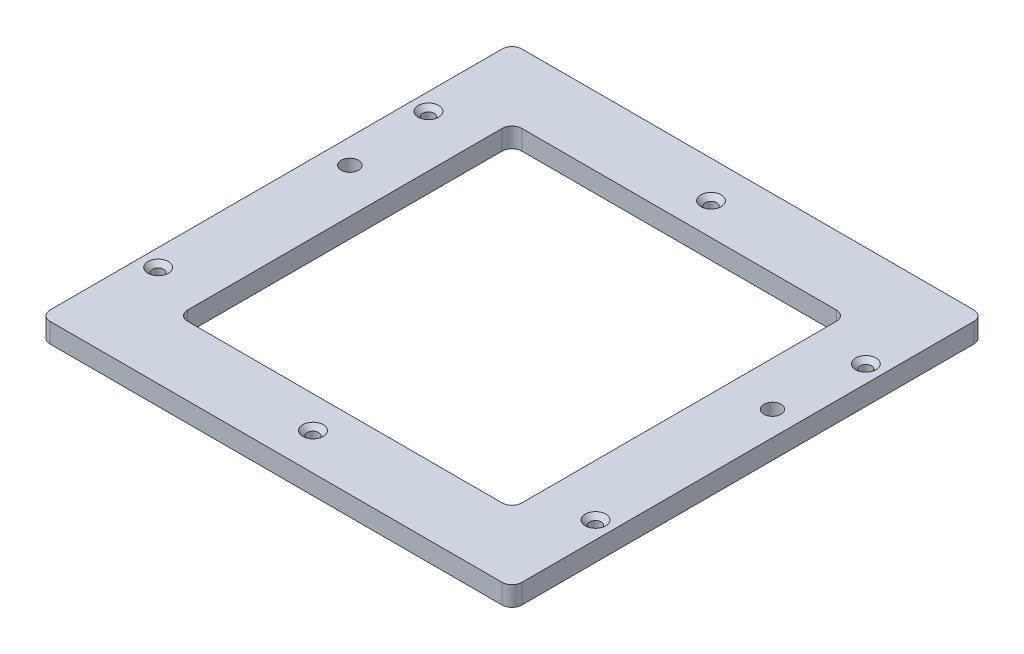
ISO-10303-21;
HEADER;
FILE_DESCRIPTION(('STEP AP214'),'2;1');
FILE_NAME('part.step','',(''),(''),'','','');
FILE_SCHEMA(('AUTOMOTIVE_DESIGN { 1 0 10303 214 1 1 1 1 }'));
ENDSEC;
DATA;
#1=APPLICATION_CONTEXT('core data for automotive mechanical design processes');
#2=APPLICATION_PROTOCOL_DEFINITION('international standard','automotive_design',2000,#1);
#3=PRODUCT_CONTEXT('',#1,'mechanical');
#4=PRODUCT('Part','Part','',(#3));
#5=PRODUCT_RELATED_PRODUCT_CATEGORY('part','',(#4));
#6=PRODUCT_DEFINITION_FORMATION('','',#4);
#7=PRODUCT_DEFINITION_CONTEXT('part definition',#1,'design');
#8=PRODUCT_DEFINITION('design','',#6,#7);
#9=PRODUCT_DEFINITION_SHAPE('','',#8);
#10=(LENGTH_UNIT() NAMED_UNIT(*) SI_UNIT(.MILLI.,.METRE.));
#11=(NAMED_UNIT(*) PLANE_ANGLE_UNIT() SI_UNIT($,.RADIAN.));
#12=(NAMED_UNIT(*) SI_UNIT($,.STERADIAN.) SOLID_ANGLE_UNIT());
#13=UNCERTAINTY_MEASURE_WITH_UNIT(LENGTH_MEASURE(1.E-05),#10,'distance_accuracy_value','');
#14=(GEOMETRIC_REPRESENTATION_CONTEXT(3) GLOBAL_UNCERTAINTY_ASSIGNED_CONTEXT((#13)) GLOBAL_UNIT_ASSIGNED_CONTEXT((#10,
#11,#12)) REPRESENTATION_CONTEXT('',''));
#15=CARTESIAN_POINT('',(0.,0.,0.));
#16=DIRECTION('',(0.,0.,1.));
#17=DIRECTION('',(1.,0.,0.));
#18=AXIS2_PLACEMENT_3D('',#15,#16,#17);
#19=CARTESIAN_POINT('',(120.,10.,-120.));
#20=DIRECTION('',(-1.,0.,0.));
#21=DIRECTION('',(0.,0.,1.));
#22=AXIS2_PLACEMENT_3D('',#19,#20,#21);
#23=PLANE('',#22);
#24=DIRECTION('',(0.,0.,-1.));
#25=VECTOR('',#24,1.);
#26=CARTESIAN_POINT('',(120.,0.,-120.));
#27=LINE('',#26,#25);
#28=CARTESIAN_POINT('',(120.,0.,115.));
#29=VERTEX_POINT('',#28);
#30=CARTESIAN_POINT('',(120.,0.,-115.));
#31=VERTEX_POINT('',#30);
#32=EDGE_CURVE('E343',#29,#31,#27,.T.);
#33=ORIENTED_EDGE('',*,*,#32,.T.);
#34=DIRECTION('',(0.,-1.,0.));
#35=VECTOR('',#34,1.);
#36=CARTESIAN_POINT('',(120.,10.,-115.));
#37=LINE('',#36,#35);
#38=CARTESIAN_POINT('',(120.,10.,-115.));
#39=VERTEX_POINT('',#38);
#40=EDGE_CURVE('E209',#31,#39,#37,.F.);
#41=ORIENTED_EDGE('',*,*,#40,.T.);
#42=DIRECTION('',(0.,0.,-1.));
#43=VECTOR('',#42,1.);
#44=CARTESIAN_POINT('',(120.,10.,-120.));
#45=LINE('',#44,#43);
#46=CARTESIAN_POINT('',(120.,10.,115.));
#47=VERTEX_POINT('',#46);
#48=EDGE_CURVE('E175',#47,#39,#45,.T.);
#49=ORIENTED_EDGE('',*,*,#48,.F.);
#50=DIRECTION('',(0.,-1.,0.));
#51=VECTOR('',#50,1.);
#52=CARTESIAN_POINT('',(120.,10.,115.));
#53=LINE('',#52,#51);
#54=EDGE_CURVE('E206',#47,#29,#53,.T.);
#55=ORIENTED_EDGE('',*,*,#54,.T.);
#56=EDGE_LOOP('',(#33,#41,#49,#55));
#57=FACE_BOUND('',#56,.T.);
#58=ADVANCED_FACE('F35',(#57),#23,.F.);
#59=CARTESIAN_POINT('',(-120.,10.,-120.));
#60=DIRECTION('',(0.,0.,1.));
#61=DIRECTION('',(1.,0.,0.));
#62=AXIS2_PLACEMENT_3D('',#59,#60,#61);
#63=PLANE('',#62);
#64=DIRECTION('',(-1.,0.,0.));
#65=VECTOR('',#64,1.);
#66=CARTESIAN_POINT('',(-120.,0.,-120.));
#67=LINE('',#66,#65);
#68=CARTESIAN_POINT('',(115.,0.,-120.));
#69=VERTEX_POINT('',#68);
#70=CARTESIAN_POINT('',(-115.,0.,-120.));
#71=VERTEX_POINT('',#70);
#72=EDGE_CURVE('E181',#69,#71,#67,.T.);
#73=ORIENTED_EDGE('',*,*,#72,.T.);
#74=DIRECTION('',(0.,-1.,0.));
#75=VECTOR('',#74,1.);
#76=CARTESIAN_POINT('',(-115.,10.,-120.));
#77=LINE('',#76,#75);
#78=CARTESIAN_POINT('',(-115.,10.,-120.));
#79=VERTEX_POINT('',#78);
#80=EDGE_CURVE('E204',#71,#79,#77,.F.);
#81=ORIENTED_EDGE('',*,*,#80,.T.);
#82=DIRECTION('',(-1.,0.,0.));
#83=VECTOR('',#82,1.);
#84=CARTESIAN_POINT('',(-120.,10.,-120.));
#85=LINE('',#84,#83);
#86=CARTESIAN_POINT('',(115.,10.,-120.));
#87=VERTEX_POINT('',#86);
#88=EDGE_CURVE('E179',#87,#79,#85,.T.);
#89=ORIENTED_EDGE('',*,*,#88,.F.);
#90=DIRECTION('',(0.,-1.,0.));
#91=VECTOR('',#90,1.);
#92=CARTESIAN_POINT('',(115.,10.,-120.));
#93=LINE('',#92,#91);
#94=EDGE_CURVE('E201',#87,#69,#93,.T.);
#95=ORIENTED_EDGE('',*,*,#94,.T.);
#96=EDGE_LOOP('',(#73,#81,#89,#95));
#97=FACE_BOUND('',#96,.T.);
#98=ADVANCED_FACE('F356',(#97),#63,.F.);
#99=CARTESIAN_POINT('',(-120.,10.,-120.));
#100=DIRECTION('',(1.,0.,0.));
#101=DIRECTION('',(0.,0.,-1.));
#102=AXIS2_PLACEMENT_3D('',#99,#100,#101);
#103=PLANE('',#102);
#104=DIRECTION('',(0.,0.,1.));
#105=VECTOR('',#104,1.);
#106=CARTESIAN_POINT('',(-120.,0.,-120.));
#107=LINE('',#106,#105);
#108=CARTESIAN_POINT('',(-120.,0.,-115.));
#109=VERTEX_POINT('',#108);
#110=CARTESIAN_POINT('',(-120.,0.,115.));
#111=VERTEX_POINT('',#110);
#112=EDGE_CURVE('E176',#109,#111,#107,.T.);
#113=ORIENTED_EDGE('',*,*,#112,.T.);
#114=DIRECTION('',(0.,-1.,0.));
#115=VECTOR('',#114,1.);
#116=CARTESIAN_POINT('',(-120.,10.,115.));
#117=LINE('',#116,#115);
#118=CARTESIAN_POINT('',(-120.,10.,115.));
#119=VERTEX_POINT('',#118);
#120=EDGE_CURVE('E154',#111,#119,#117,.F.);
#121=ORIENTED_EDGE('',*,*,#120,.T.);
#122=DIRECTION('',(0.,0.,1.));
#123=VECTOR('',#122,1.);
#124=CARTESIAN_POINT('',(-120.,10.,-120.));
#125=LINE('',#124,#123);
#126=CARTESIAN_POINT('',(-120.,10.,-115.));
#127=VERTEX_POINT('',#126);
#128=EDGE_CURVE('E347',#127,#119,#125,.T.);
#129=ORIENTED_EDGE('',*,*,#128,.F.);
#130=DIRECTION('',(0.,-1.,0.));
#131=VECTOR('',#130,1.);
#132=CARTESIAN_POINT('',(-120.,10.,-115.));
#133=LINE('',#132,#131);
#134=EDGE_CURVE('E159',#127,#109,#133,.T.);
#135=ORIENTED_EDGE('',*,*,#134,.T.);
#136=EDGE_LOOP('',(#113,#121,#129,#135));
#137=FACE_BOUND('',#136,.T.);
#138=ADVANCED_FACE('F366',(#137),#103,.F.);
#139=CARTESIAN_POINT('',(-120.,10.,120.));
#140=DIRECTION('',(0.,0.,-1.));
#141=DIRECTION('',(-1.,0.,0.));
#142=AXIS2_PLACEMENT_3D('',#139,#140,#141);
#143=PLANE('',#142);
#144=DIRECTION('',(1.,0.,0.));
#145=VECTOR('',#144,1.);
#146=CARTESIAN_POINT('',(-120.,10.,120.));
#147=LINE('',#146,#145);
#148=CARTESIAN_POINT('',(-115.,10.,120.));
#149=VERTEX_POINT('',#148);
#150=CARTESIAN_POINT('',(115.,10.,120.));
#151=VERTEX_POINT('',#150);
#152=EDGE_CURVE('E169',#149,#151,#147,.T.);
#153=ORIENTED_EDGE('',*,*,#152,.F.);
#154=DIRECTION('',(0.,-1.,0.));
#155=VECTOR('',#154,1.);
#156=CARTESIAN_POINT('',(-115.,10.,120.));
#157=LINE('',#156,#155);
#158=CARTESIAN_POINT('',(-115.,0.,120.));
#159=VERTEX_POINT('',#158);
#160=EDGE_CURVE('E153',#149,#159,#157,.T.);
#161=ORIENTED_EDGE('',*,*,#160,.T.);
#162=DIRECTION('',(1.,0.,0.));
#163=VECTOR('',#162,1.);
#164=CARTESIAN_POINT('',(-120.,0.,120.));
#165=LINE('',#164,#163);
#166=CARTESIAN_POINT('',(115.,0.,120.));
#167=VERTEX_POINT('',#166);
#168=EDGE_CURVE('E166',#159,#167,#165,.T.);
#169=ORIENTED_EDGE('',*,*,#168,.T.);
#170=DIRECTION('',(0.,-1.,0.));
#171=VECTOR('',#170,1.);
#172=CARTESIAN_POINT('',(115.,10.,120.));
#173=LINE('',#172,#171);
#174=EDGE_CURVE('E171',#167,#151,#173,.F.);
#175=ORIENTED_EDGE('',*,*,#174,.T.);
#176=EDGE_LOOP('',(#153,#161,#169,#175));
#177=FACE_BOUND('',#176,.T.);
#178=ADVANCED_FACE('F165',(#177),#143,.F.);
#179=CARTESIAN_POINT('',(0.,10.,0.));
#180=DIRECTION('',(0.,1.,0.));
#181=DIRECTION('',(0.,0.,1.));
#182=AXIS2_PLACEMENT_3D('',#179,#180,#181);
#183=PLANE('',#182);
#184=DIRECTION('',(-1.,0.,0.));
#185=VECTOR('',#184,1.);
#186=CARTESIAN_POINT('',(85.,10.,-85.));
#187=LINE('',#186,#185);
#188=CARTESIAN_POINT('',(80.,10.,-85.));
#189=VERTEX_POINT('',#188);
#190=CARTESIAN_POINT('',(-80.,10.,-85.));
#191=VERTEX_POINT('',#190);
#192=EDGE_CURVE('E250',#189,#191,#187,.T.);
#193=ORIENTED_EDGE('',*,*,#192,.F.);
#194=CARTESIAN_POINT('',(80.,10.,-80.));
#195=DIRECTION('',(0.,1.,0.));
#196=DIRECTION('',(0.,0.,1.));
#197=AXIS2_PLACEMENT_3D('',#194,#195,#196);
#198=CIRCLE('',#197,5.);
#199=CARTESIAN_POINT('',(85.,10.,-80.));
#200=VERTEX_POINT('',#199);
#201=EDGE_CURVE('E243',#189,#200,#198,.F.);
#202=ORIENTED_EDGE('',*,*,#201,.T.);
#203=DIRECTION('',(0.,0.,-1.));
#204=VECTOR('',#203,1.);
#205=CARTESIAN_POINT('',(85.,10.,85.));
#206=LINE('',#205,#204);
#207=CARTESIAN_POINT('',(85.,10.,80.));
#208=VERTEX_POINT('',#207);
#209=EDGE_CURVE('E273',#208,#200,#206,.T.);
#210=ORIENTED_EDGE('',*,*,#209,.F.);
#211=CARTESIAN_POINT('',(80.,10.,80.));
#212=DIRECTION('',(0.,1.,0.));
#213=DIRECTION('',(0.,0.,1.));
#214=AXIS2_PLACEMENT_3D('',#211,#212,#213);
#215=CIRCLE('',#214,5.);
#216=CARTESIAN_POINT('',(80.,10.,85.));
#217=VERTEX_POINT('',#216);
#218=EDGE_CURVE('E235',#208,#217,#215,.F.);
#219=ORIENTED_EDGE('',*,*,#218,.T.);
#220=DIRECTION('',(1.,0.,0.));
#221=VECTOR('',#220,1.);
#222=CARTESIAN_POINT('',(-85.,10.,85.));
#223=LINE('',#222,#221);
#224=CARTESIAN_POINT('',(-80.,10.,85.));
#225=VERTEX_POINT('',#224);
#226=EDGE_CURVE('E278',#225,#217,#223,.T.);
#227=ORIENTED_EDGE('',*,*,#226,.F.);
#228=CARTESIAN_POINT('',(-80.,10.,80.));
#229=DIRECTION('',(0.,1.,0.));
#230=DIRECTION('',(0.,0.,1.));
#231=AXIS2_PLACEMENT_3D('',#228,#229,#230);
#232=CIRCLE('',#231,5.);
#233=CARTESIAN_POINT('',(-85.,10.,80.));
#234=VERTEX_POINT('',#233);
#235=EDGE_CURVE('E239',#225,#234,#232,.F.);
#236=ORIENTED_EDGE('',*,*,#235,.T.);
#237=DIRECTION('',(0.,0.,1.));
#238=VECTOR('',#237,1.);
#239=CARTESIAN_POINT('',(-85.,10.,-85.));
#240=LINE('',#239,#238);
#241=CARTESIAN_POINT('',(-85.,10.,-80.));
#242=VERTEX_POINT('',#241);
#243=EDGE_CURVE('E252',#242,#234,#240,.T.);
#244=ORIENTED_EDGE('',*,*,#243,.F.);
#245=CARTESIAN_POINT('',(-80.,10.,-80.));
#246=DIRECTION('',(0.,1.,0.));
#247=DIRECTION('',(0.,0.,1.));
#248=AXIS2_PLACEMENT_3D('',#245,#246,#247);
#249=CIRCLE('',#248,5.);
#250=EDGE_CURVE('E43',#242,#191,#249,.F.);
#251=ORIENTED_EDGE('',*,*,#250,.T.);
#252=EDGE_LOOP('',(#193,#202,#210,#219,#227,#236,#244,#251));
#253=FACE_BOUND('',#252,.T.);
#254=CARTESIAN_POINT('',(107.5,10.,-25.));
#255=DIRECTION('',(0.,1.,0.));
#256=DIRECTION('',(0.,0.,1.));
#257=AXIS2_PLACEMENT_3D('',#254,#255,#256);
#258=CIRCLE('',#257,4.4);
#259=CARTESIAN_POINT('',(107.5,10.,-20.6));
#260=VERTEX_POINT('',#259);
#261=EDGE_CURVE('E216',#260,#260,#258,.T.);
#262=ORIENTED_EDGE('',*,*,#261,.F.);
#263=EDGE_LOOP('',(#262));
#264=FACE_BOUND('',#263,.T.);
#265=CARTESIAN_POINT('',(-107.5,10.,-25.));
#266=DIRECTION('',(0.,1.,0.));
#267=DIRECTION('',(0.,0.,1.));
#268=AXIS2_PLACEMENT_3D('',#265,#266,#267);
#269=CIRCLE('',#268,4.4);
#270=CARTESIAN_POINT('',(-107.5,10.,-20.6));
#271=VERTEX_POINT('',#270);
#272=EDGE_CURVE('E215',#271,#271,#269,.T.);
#273=ORIENTED_EDGE('',*,*,#272,.F.);
#274=EDGE_LOOP('',(#273));
#275=FACE_BOUND('',#274,.T.);
#276=CARTESIAN_POINT('',(-111.25,10.,-68.75));
#277=DIRECTION('',(0.,1.,0.));
#278=DIRECTION('',(0.,0.,1.));
#279=AXIS2_PLACEMENT_3D('',#276,#277,#278);
#280=CIRCLE('',#279,5.2);
#281=CARTESIAN_POINT('',(-111.25,10.,-63.55));
#282=VERTEX_POINT('',#281);
#283=EDGE_CURVE('E290',#282,#282,#280,.T.);
#284=ORIENTED_EDGE('',*,*,#283,.F.);
#285=EDGE_LOOP('',(#284));
#286=FACE_BOUND('',#285,.T.);
#287=CARTESIAN_POINT('',(0.,10.,-101.25));
#288=DIRECTION('',(0.,1.,0.));
#289=DIRECTION('',(0.,0.,1.));
#290=AXIS2_PLACEMENT_3D('',#287,#288,#289);
#291=CIRCLE('',#290,5.2);
#292=CARTESIAN_POINT('',(0.,10.,-96.05));
#293=VERTEX_POINT('',#292);
#294=EDGE_CURVE('E299',#293,#293,#291,.T.);
#295=ORIENTED_EDGE('',*,*,#294,.F.);
#296=EDGE_LOOP('',(#295));
#297=FACE_BOUND('',#296,.T.);
#298=CARTESIAN_POINT('',(111.25,10.,-68.75));
#299=DIRECTION('',(0.,1.,0.));
#300=DIRECTION('',(0.,0.,1.));
#301=AXIS2_PLACEMENT_3D('',#298,#299,#300);
#302=CIRCLE('',#301,5.2);
#303=CARTESIAN_POINT('',(111.25,10.,-63.55));
#304=VERTEX_POINT('',#303);
#305=EDGE_CURVE('E308',#304,#304,#302,.T.);
#306=ORIENTED_EDGE('',*,*,#305,.F.);
#307=EDGE_LOOP('',(#306));
#308=FACE_BOUND('',#307,.T.);
#309=CARTESIAN_POINT('',(111.25,10.,68.75));
#310=DIRECTION('',(0.,1.,0.));
#311=DIRECTION('',(0.,0.,1.));
#312=AXIS2_PLACEMENT_3D('',#309,#310,#311);
#313=CIRCLE('',#312,5.2);
#314=CARTESIAN_POINT('',(111.25,10.,73.95));
#315=VERTEX_POINT('',#314);
#316=EDGE_CURVE('E317',#315,#315,#313,.T.);
#317=ORIENTED_EDGE('',*,*,#316,.F.);
#318=EDGE_LOOP('',(#317));
#319=FACE_BOUND('',#318,.T.);
#320=CARTESIAN_POINT('',(0.,10.,101.25));
#321=DIRECTION('',(0.,1.,0.));
#322=DIRECTION('',(0.,0.,1.));
#323=AXIS2_PLACEMENT_3D('',#320,#321,#322);
#324=CIRCLE('',#323,5.2);
#325=CARTESIAN_POINT('',(0.,10.,106.45));
#326=VERTEX_POINT('',#325);
#327=EDGE_CURVE('E326',#326,#326,#324,.T.);
#328=ORIENTED_EDGE('',*,*,#327,.F.);
#329=EDGE_LOOP('',(#328));
#330=FACE_BOUND('',#329,.T.);
#331=CARTESIAN_POINT('',(-111.25,10.,68.75));
#332=DIRECTION('',(0.,1.,0.));
#333=DIRECTION('',(0.,0.,1.));
#334=AXIS2_PLACEMENT_3D('',#331,#332,#333);
#335=CIRCLE('',#334,5.2);
#336=CARTESIAN_POINT('',(-111.25,10.,73.95));
#337=VERTEX_POINT('',#336);
#338=EDGE_CURVE('E335',#337,#337,#335,.T.);
#339=ORIENTED_EDGE('',*,*,#338,.F.);
#340=EDGE_LOOP('',(#339));
#341=FACE_BOUND('',#340,.T.);
#342=ORIENTED_EDGE('',*,*,#128,.T.);
#343=CARTESIAN_POINT('',(-115.,10.,115.));
#344=DIRECTION('',(0.,1.,0.));
#345=DIRECTION('',(0.,0.,1.));
#346=AXIS2_PLACEMENT_3D('',#343,#344,#345);
#347=CIRCLE('',#346,5.);
#348=EDGE_CURVE('E199',#119,#149,#347,.T.);
#349=ORIENTED_EDGE('',*,*,#348,.T.);
#350=ORIENTED_EDGE('',*,*,#152,.T.);
#351=CARTESIAN_POINT('',(115.,10.,115.));
#352=DIRECTION('',(0.,1.,0.));
#353=DIRECTION('',(0.,0.,1.));
#354=AXIS2_PLACEMENT_3D('',#351,#352,#353);
#355=CIRCLE('',#354,5.);
#356=EDGE_CURVE('E193',#151,#47,#355,.T.);
#357=ORIENTED_EDGE('',*,*,#356,.T.);
#358=ORIENTED_EDGE('',*,*,#48,.T.);
#359=CARTESIAN_POINT('',(115.,10.,-115.));
#360=DIRECTION('',(0.,1.,0.));
#361=DIRECTION('',(0.,0.,1.));
#362=AXIS2_PLACEMENT_3D('',#359,#360,#361);
#363=CIRCLE('',#362,5.);
#364=EDGE_CURVE('E195',#39,#87,#363,.T.);
#365=ORIENTED_EDGE('',*,*,#364,.T.);
#366=ORIENTED_EDGE('',*,*,#88,.T.);
#367=CARTESIAN_POINT('',(-115.,10.,-115.));
#368=DIRECTION('',(0.,1.,0.));
#369=DIRECTION('',(0.,0.,1.));
#370=AXIS2_PLACEMENT_3D('',#367,#368,#369);
#371=CIRCLE('',#370,5.);
#372=EDGE_CURVE('E197',#79,#127,#371,.T.);
#373=ORIENTED_EDGE('',*,*,#372,.T.);
#374=EDGE_LOOP('',(#342,#349,#350,#357,#358,#365,#366,#373));
#375=FACE_BOUND('',#374,.T.);
#376=ADVANCED_FACE('F248',(#253,#264,#275,#286,#297,#308,#319,#330,#341,#375),#183,.T.);
#377=CARTESIAN_POINT('',(0.,0.,0.));
#378=DIRECTION('',(0.,1.,0.));
#379=DIRECTION('',(0.,0.,1.));
#380=AXIS2_PLACEMENT_3D('',#377,#378,#379);
#381=PLANE('',#380);
#382=DIRECTION('',(1.,0.,0.));
#383=VECTOR('',#382,1.);
#384=CARTESIAN_POINT('',(-85.,0.,85.));
#385=LINE('',#384,#383);
#386=CARTESIAN_POINT('',(-80.,0.,85.));
#387=VERTEX_POINT('',#386);
#388=CARTESIAN_POINT('',(80.,0.,85.));
#389=VERTEX_POINT('',#388);
#390=EDGE_CURVE('E269',#387,#389,#385,.T.);
#391=ORIENTED_EDGE('',*,*,#390,.T.);
#392=CARTESIAN_POINT('',(80.,0.,80.));
#393=DIRECTION('',(0.,1.,0.));
#394=DIRECTION('',(0.,0.,1.));
#395=AXIS2_PLACEMENT_3D('',#392,#393,#394);
#396=CIRCLE('',#395,5.);
#397=CARTESIAN_POINT('',(85.,0.,80.));
#398=VERTEX_POINT('',#397);
#399=EDGE_CURVE('E237',#389,#398,#396,.T.);
#400=ORIENTED_EDGE('',*,*,#399,.T.);
#401=DIRECTION('',(0.,0.,-1.));
#402=VECTOR('',#401,1.);
#403=CARTESIAN_POINT('',(85.,0.,85.));
#404=LINE('',#403,#402);
#405=CARTESIAN_POINT('',(85.,0.,-80.));
#406=VERTEX_POINT('',#405);
#407=EDGE_CURVE('E271',#398,#406,#404,.T.);
#408=ORIENTED_EDGE('',*,*,#407,.T.);
#409=CARTESIAN_POINT('',(80.,0.,-80.));
#410=DIRECTION('',(0.,1.,0.));
#411=DIRECTION('',(0.,0.,1.));
#412=AXIS2_PLACEMENT_3D('',#409,#410,#411);
#413=CIRCLE('',#412,5.);
#414=CARTESIAN_POINT('',(80.,0.,-85.));
#415=VERTEX_POINT('',#414);
#416=EDGE_CURVE('E57',#406,#415,#413,.T.);
#417=ORIENTED_EDGE('',*,*,#416,.T.);
#418=DIRECTION('',(-1.,0.,0.));
#419=VECTOR('',#418,1.);
#420=CARTESIAN_POINT('',(85.,0.,-85.));
#421=LINE('',#420,#419);
#422=CARTESIAN_POINT('',(-80.,0.,-85.));
#423=VERTEX_POINT('',#422);
#424=EDGE_CURVE('E265',#415,#423,#421,.T.);
#425=ORIENTED_EDGE('',*,*,#424,.T.);
#426=CARTESIAN_POINT('',(-80.,0.,-80.));
#427=DIRECTION('',(0.,1.,0.));
#428=DIRECTION('',(0.,0.,1.));
#429=AXIS2_PLACEMENT_3D('',#426,#427,#428);
#430=CIRCLE('',#429,5.);
#431=CARTESIAN_POINT('',(-85.,0.,-80.));
#432=VERTEX_POINT('',#431);
#433=EDGE_CURVE('E11',#423,#432,#430,.T.);
#434=ORIENTED_EDGE('',*,*,#433,.T.);
#435=DIRECTION('',(0.,0.,1.));
#436=VECTOR('',#435,1.);
#437=CARTESIAN_POINT('',(-85.,0.,-85.));
#438=LINE('',#437,#436);
#439=CARTESIAN_POINT('',(-85.,0.,80.));
#440=VERTEX_POINT('',#439);
#441=EDGE_CURVE('E263',#432,#440,#438,.T.);
#442=ORIENTED_EDGE('',*,*,#441,.T.);
#443=CARTESIAN_POINT('',(-80.,0.,80.));
#444=DIRECTION('',(0.,1.,0.));
#445=DIRECTION('',(0.,0.,1.));
#446=AXIS2_PLACEMENT_3D('',#443,#444,#445);
#447=CIRCLE('',#446,5.);
#448=EDGE_CURVE('E241',#440,#387,#447,.T.);
#449=ORIENTED_EDGE('',*,*,#448,.T.);
#450=EDGE_LOOP('',(#391,#400,#408,#417,#425,#434,#442,#449));
#451=FACE_BOUND('',#450,.T.);
#452=CARTESIAN_POINT('',(107.5,0.,-25.));
#453=DIRECTION('',(0.,1.,0.));
#454=DIRECTION('',(0.,0.,1.));
#455=AXIS2_PLACEMENT_3D('',#452,#453,#454);
#456=CIRCLE('',#455,4.4);
#457=CARTESIAN_POINT('',(107.5,0.,-20.6));
#458=VERTEX_POINT('',#457);
#459=EDGE_CURVE('E212',#458,#458,#456,.T.);
#460=ORIENTED_EDGE('',*,*,#459,.T.);
#461=EDGE_LOOP('',(#460));
#462=FACE_BOUND('',#461,.T.);
#463=CARTESIAN_POINT('',(-107.5,0.,-25.));
#464=DIRECTION('',(0.,1.,0.));
#465=DIRECTION('',(0.,0.,1.));
#466=AXIS2_PLACEMENT_3D('',#463,#464,#465);
#467=CIRCLE('',#466,4.4);
#468=CARTESIAN_POINT('',(-107.5,0.,-20.6));
#469=VERTEX_POINT('',#468);
#470=EDGE_CURVE('E287',#469,#469,#467,.T.);
#471=ORIENTED_EDGE('',*,*,#470,.T.);
#472=EDGE_LOOP('',(#471));
#473=FACE_BOUND('',#472,.T.);
#474=CARTESIAN_POINT('',(-111.25,0.,-68.75));
#475=DIRECTION('',(0.,1.,0.));
#476=DIRECTION('',(0.,0.,1.));
#477=AXIS2_PLACEMENT_3D('',#474,#475,#476);
#478=CIRCLE('',#477,2.9);
#479=CARTESIAN_POINT('',(-111.25,0.,-65.85));
#480=VERTEX_POINT('',#479);
#481=EDGE_CURVE('E296',#480,#480,#478,.T.);
#482=ORIENTED_EDGE('',*,*,#481,.T.);
#483=EDGE_LOOP('',(#482));
#484=FACE_BOUND('',#483,.T.);
#485=CARTESIAN_POINT('',(0.,0.,-101.25));
#486=DIRECTION('',(0.,1.,0.));
#487=DIRECTION('',(0.,0.,1.));
#488=AXIS2_PLACEMENT_3D('',#485,#486,#487);
#489=CIRCLE('',#488,2.9);
#490=CARTESIAN_POINT('',(0.,0.,-98.35));
#491=VERTEX_POINT('',#490);
#492=EDGE_CURVE('E305',#491,#491,#489,.T.);
#493=ORIENTED_EDGE('',*,*,#492,.T.);
#494=EDGE_LOOP('',(#493));
#495=FACE_BOUND('',#494,.T.);
#496=CARTESIAN_POINT('',(111.25,0.,-68.75));
#497=DIRECTION('',(0.,1.,0.));
#498=DIRECTION('',(0.,0.,1.));
#499=AXIS2_PLACEMENT_3D('',#496,#497,#498);
#500=CIRCLE('',#499,2.9);
#501=CARTESIAN_POINT('',(111.25,0.,-65.85));
#502=VERTEX_POINT('',#501);
#503=EDGE_CURVE('E314',#502,#502,#500,.T.);
#504=ORIENTED_EDGE('',*,*,#503,.T.);
#505=EDGE_LOOP('',(#504));
#506=FACE_BOUND('',#505,.T.);
#507=CARTESIAN_POINT('',(111.25,0.,68.75));
#508=DIRECTION('',(0.,1.,0.));
#509=DIRECTION('',(0.,0.,1.));
#510=AXIS2_PLACEMENT_3D('',#507,#508,#509);
#511=CIRCLE('',#510,2.9);
#512=CARTESIAN_POINT('',(111.25,0.,71.65));
#513=VERTEX_POINT('',#512);
#514=EDGE_CURVE('E323',#513,#513,#511,.T.);
#515=ORIENTED_EDGE('',*,*,#514,.T.);
#516=EDGE_LOOP('',(#515));
#517=FACE_BOUND('',#516,.T.);
#518=CARTESIAN_POINT('',(0.,0.,101.25));
#519=DIRECTION('',(0.,1.,0.));
#520=DIRECTION('',(0.,0.,1.));
#521=AXIS2_PLACEMENT_3D('',#518,#519,#520);
#522=CIRCLE('',#521,2.9);
#523=CARTESIAN_POINT('',(0.,0.,104.15));
#524=VERTEX_POINT('',#523);
#525=EDGE_CURVE('E332',#524,#524,#522,.T.);
#526=ORIENTED_EDGE('',*,*,#525,.T.);
#527=EDGE_LOOP('',(#526));
#528=FACE_BOUND('',#527,.T.);
#529=CARTESIAN_POINT('',(-111.25,0.,68.75));
#530=DIRECTION('',(0.,1.,0.));
#531=DIRECTION('',(0.,0.,1.));
#532=AXIS2_PLACEMENT_3D('',#529,#530,#531);
#533=CIRCLE('',#532,2.9);
#534=CARTESIAN_POINT('',(-111.25,0.,71.65));
#535=VERTEX_POINT('',#534);
#536=EDGE_CURVE('E341',#535,#535,#533,.T.);
#537=ORIENTED_EDGE('',*,*,#536,.T.);
#538=EDGE_LOOP('',(#537));
#539=FACE_BOUND('',#538,.T.);
#540=ORIENTED_EDGE('',*,*,#168,.F.);
#541=CARTESIAN_POINT('',(-115.,0.,115.));
#542=DIRECTION('',(0.,1.,0.));
#543=DIRECTION('',(0.,0.,1.));
#544=AXIS2_PLACEMENT_3D('',#541,#542,#543);
#545=CIRCLE('',#544,5.);
#546=EDGE_CURVE('E149',#159,#111,#545,.F.);
#547=ORIENTED_EDGE('',*,*,#546,.T.);
#548=ORIENTED_EDGE('',*,*,#112,.F.);
#549=CARTESIAN_POINT('',(-115.,0.,-115.));
#550=DIRECTION('',(0.,1.,0.));
#551=DIRECTION('',(0.,0.,1.));
#552=AXIS2_PLACEMENT_3D('',#549,#550,#551);
#553=CIRCLE('',#552,5.);
#554=EDGE_CURVE('E160',#109,#71,#553,.F.);
#555=ORIENTED_EDGE('',*,*,#554,.T.);
#556=ORIENTED_EDGE('',*,*,#72,.F.);
#557=CARTESIAN_POINT('',(115.,0.,-115.));
#558=DIRECTION('',(0.,1.,0.));
#559=DIRECTION('',(0.,0.,1.));
#560=AXIS2_PLACEMENT_3D('',#557,#558,#559);
#561=CIRCLE('',#560,5.);
#562=EDGE_CURVE('E187',#69,#31,#561,.F.);
#563=ORIENTED_EDGE('',*,*,#562,.T.);
#564=ORIENTED_EDGE('',*,*,#32,.F.);
#565=CARTESIAN_POINT('',(115.,0.,115.));
#566=DIRECTION('',(0.,1.,0.));
#567=DIRECTION('',(0.,0.,1.));
#568=AXIS2_PLACEMENT_3D('',#565,#566,#567);
#569=CIRCLE('',#568,5.);
#570=EDGE_CURVE('E170',#29,#167,#569,.F.);
#571=ORIENTED_EDGE('',*,*,#570,.T.);
#572=EDGE_LOOP('',(#540,#547,#548,#555,#556,#563,#564,#571));
#573=FACE_BOUND('',#572,.T.);
#574=ADVANCED_FACE('F173',(#451,#462,#473,#484,#495,#506,#517,#528,#539,#573),#381,.F.);
#575=CARTESIAN_POINT('',(-111.25,10.,68.75));
#576=DIRECTION('',(0.,1.,0.));
#577=DIRECTION('',(0.,0.,1.));
#578=AXIS2_PLACEMENT_3D('',#575,#576,#577);
#579=CYLINDRICAL_SURFACE('',#578,2.9);
#580=ORIENTED_EDGE('',*,*,#536,.F.);
#581=EDGE_LOOP('',(#580));
#582=FACE_BOUND('',#581,.T.);
#583=CARTESIAN_POINT('',(-111.25,7.69999999999999,68.75));
#584=DIRECTION('',(0.,1.,0.));
#585=DIRECTION('',(0.,0.,1.));
#586=AXIS2_PLACEMENT_3D('',#583,#584,#585);
#587=CIRCLE('',#586,2.9);
#588=CARTESIAN_POINT('',(-111.25,7.69999999999999,71.65));
#589=VERTEX_POINT('',#588);
#590=EDGE_CURVE('E338',#589,#589,#587,.T.);
#591=ORIENTED_EDGE('',*,*,#590,.T.);
#592=EDGE_LOOP('',(#591));
#593=FACE_BOUND('',#592,.T.);
#594=ADVANCED_FACE('F481',(#582,#593),#579,.F.);
#595=CARTESIAN_POINT('',(-111.25,10.,68.75));
#596=DIRECTION('',(0.,1.,0.));
#597=DIRECTION('',(0.,0.,1.));
#598=AXIS2_PLACEMENT_3D('',#595,#596,#597);
#599=CONICAL_SURFACE('',#598,5.2,0.785398163397446);
#600=ORIENTED_EDGE('',*,*,#590,.F.);
#601=EDGE_LOOP('',(#600));
#602=FACE_BOUND('',#601,.T.);
#603=ORIENTED_EDGE('',*,*,#338,.T.);
#604=EDGE_LOOP('',(#603));
#605=FACE_BOUND('',#604,.T.);
#606=ADVANCED_FACE('F477',(#602,#605),#599,.F.);
#607=CARTESIAN_POINT('',(0.,10.,101.25));
#608=DIRECTION('',(0.,1.,0.));
#609=DIRECTION('',(0.,0.,1.));
#610=AXIS2_PLACEMENT_3D('',#607,#608,#609);
#611=CYLINDRICAL_SURFACE('',#610,2.9);
#612=ORIENTED_EDGE('',*,*,#525,.F.);
#613=EDGE_LOOP('',(#612));
#614=FACE_BOUND('',#613,.T.);
#615=CARTESIAN_POINT('',(0.,7.69999999999999,101.25));
#616=DIRECTION('',(0.,1.,0.));
#617=DIRECTION('',(0.,0.,1.));
#618=AXIS2_PLACEMENT_3D('',#615,#616,#617);
#619=CIRCLE('',#618,2.9);
#620=CARTESIAN_POINT('',(0.,7.69999999999999,104.15));
#621=VERTEX_POINT('',#620);
#622=EDGE_CURVE('E329',#621,#621,#619,.T.);
#623=ORIENTED_EDGE('',*,*,#622,.T.);
#624=EDGE_LOOP('',(#623));
#625=FACE_BOUND('',#624,.T.);
#626=ADVANCED_FACE('F473',(#614,#625),#611,.F.);
#627=CARTESIAN_POINT('',(0.,10.,101.25));
#628=DIRECTION('',(0.,1.,0.));
#629=DIRECTION('',(0.,0.,1.));
#630=AXIS2_PLACEMENT_3D('',#627,#628,#629);
#631=CONICAL_SURFACE('',#630,5.2,0.785398163397448);
#632=ORIENTED_EDGE('',*,*,#622,.F.);
#633=EDGE_LOOP('',(#632));
#634=FACE_BOUND('',#633,.T.);
#635=ORIENTED_EDGE('',*,*,#327,.T.);
#636=EDGE_LOOP('',(#635));
#637=FACE_BOUND('',#636,.T.);
#638=ADVANCED_FACE('F469',(#634,#637),#631,.F.);
#639=CARTESIAN_POINT('',(111.25,10.,68.75));
#640=DIRECTION('',(0.,1.,0.));
#641=DIRECTION('',(0.,0.,1.));
#642=AXIS2_PLACEMENT_3D('',#639,#640,#641);
#643=CYLINDRICAL_SURFACE('',#642,2.9);
#644=ORIENTED_EDGE('',*,*,#514,.F.);
#645=EDGE_LOOP('',(#644));
#646=FACE_BOUND('',#645,.T.);
#647=CARTESIAN_POINT('',(111.25,7.69999999999999,68.75));
#648=DIRECTION('',(0.,1.,0.));
#649=DIRECTION('',(0.,0.,1.));
#650=AXIS2_PLACEMENT_3D('',#647,#648,#649);
#651=CIRCLE('',#650,2.9);
#652=CARTESIAN_POINT('',(111.25,7.69999999999999,71.65));
#653=VERTEX_POINT('',#652);
#654=EDGE_CURVE('E320',#653,#653,#651,.T.);
#655=ORIENTED_EDGE('',*,*,#654,.T.);
#656=EDGE_LOOP('',(#655));
#657=FACE_BOUND('',#656,.T.);
#658=ADVANCED_FACE('F465',(#646,#657),#643,.F.);
#659=CARTESIAN_POINT('',(111.25,10.,68.75));
#660=DIRECTION('',(0.,1.,0.));
#661=DIRECTION('',(0.,0.,1.));
#662=AXIS2_PLACEMENT_3D('',#659,#660,#661);
#663=CONICAL_SURFACE('',#662,5.2,0.785398163397446);
#664=ORIENTED_EDGE('',*,*,#654,.F.);
#665=EDGE_LOOP('',(#664));
#666=FACE_BOUND('',#665,.T.);
#667=ORIENTED_EDGE('',*,*,#316,.T.);
#668=EDGE_LOOP('',(#667));
#669=FACE_BOUND('',#668,.T.);
#670=ADVANCED_FACE('F461',(#666,#669),#663,.F.);
#671=CARTESIAN_POINT('',(111.25,10.,-68.75));
#672=DIRECTION('',(0.,1.,0.));
#673=DIRECTION('',(0.,0.,1.));
#674=AXIS2_PLACEMENT_3D('',#671,#672,#673);
#675=CYLINDRICAL_SURFACE('',#674,2.9);
#676=ORIENTED_EDGE('',*,*,#503,.F.);
#677=EDGE_LOOP('',(#676));
#678=FACE_BOUND('',#677,.T.);
#679=CARTESIAN_POINT('',(111.25,7.69999999999999,-68.75));
#680=DIRECTION('',(0.,1.,0.));
#681=DIRECTION('',(0.,0.,1.));
#682=AXIS2_PLACEMENT_3D('',#679,#680,#681);
#683=CIRCLE('',#682,2.9);
#684=CARTESIAN_POINT('',(111.25,7.69999999999999,-65.85));
#685=VERTEX_POINT('',#684);
#686=EDGE_CURVE('E311',#685,#685,#683,.T.);
#687=ORIENTED_EDGE('',*,*,#686,.T.);
#688=EDGE_LOOP('',(#687));
#689=FACE_BOUND('',#688,.T.);
#690=ADVANCED_FACE('F457',(#678,#689),#675,.F.);
#691=CARTESIAN_POINT('',(111.25,10.,-68.75));
#692=DIRECTION('',(0.,1.,0.));
#693=DIRECTION('',(0.,0.,1.));
#694=AXIS2_PLACEMENT_3D('',#691,#692,#693);
#695=CONICAL_SURFACE('',#694,5.2,0.785398163397446);
#696=ORIENTED_EDGE('',*,*,#686,.F.);
#697=EDGE_LOOP('',(#696));
#698=FACE_BOUND('',#697,.T.);
#699=ORIENTED_EDGE('',*,*,#305,.T.);
#700=EDGE_LOOP('',(#699));
#701=FACE_BOUND('',#700,.T.);
#702=ADVANCED_FACE('F453',(#698,#701),#695,.F.);
#703=CARTESIAN_POINT('',(0.,10.,-101.25));
#704=DIRECTION('',(0.,1.,0.));
#705=DIRECTION('',(0.,0.,1.));
#706=AXIS2_PLACEMENT_3D('',#703,#704,#705);
#707=CYLINDRICAL_SURFACE('',#706,2.9);
#708=ORIENTED_EDGE('',*,*,#492,.F.);
#709=EDGE_LOOP('',(#708));
#710=FACE_BOUND('',#709,.T.);
#711=CARTESIAN_POINT('',(0.,7.69999999999999,-101.25));
#712=DIRECTION('',(0.,1.,0.));
#713=DIRECTION('',(0.,0.,1.));
#714=AXIS2_PLACEMENT_3D('',#711,#712,#713);
#715=CIRCLE('',#714,2.9);
#716=CARTESIAN_POINT('',(0.,7.69999999999999,-98.35));
#717=VERTEX_POINT('',#716);
#718=EDGE_CURVE('E302',#717,#717,#715,.T.);
#719=ORIENTED_EDGE('',*,*,#718,.T.);
#720=EDGE_LOOP('',(#719));
#721=FACE_BOUND('',#720,.T.);
#722=ADVANCED_FACE('F449',(#710,#721),#707,.F.);
#723=CARTESIAN_POINT('',(0.,10.,-101.25));
#724=DIRECTION('',(0.,1.,0.));
#725=DIRECTION('',(0.,0.,1.));
#726=AXIS2_PLACEMENT_3D('',#723,#724,#725);
#727=CONICAL_SURFACE('',#726,5.2,0.785398163397448);
#728=ORIENTED_EDGE('',*,*,#718,.F.);
#729=EDGE_LOOP('',(#728));
#730=FACE_BOUND('',#729,.T.);
#731=ORIENTED_EDGE('',*,*,#294,.T.);
#732=EDGE_LOOP('',(#731));
#733=FACE_BOUND('',#732,.T.);
#734=ADVANCED_FACE('F445',(#730,#733),#727,.F.);
#735=CARTESIAN_POINT('',(-111.25,10.,-68.75));
#736=DIRECTION('',(0.,1.,0.));
#737=DIRECTION('',(0.,0.,1.));
#738=AXIS2_PLACEMENT_3D('',#735,#736,#737);
#739=CYLINDRICAL_SURFACE('',#738,2.9);
#740=ORIENTED_EDGE('',*,*,#481,.F.);
#741=EDGE_LOOP('',(#740));
#742=FACE_BOUND('',#741,.T.);
#743=CARTESIAN_POINT('',(-111.25,7.69999999999999,-68.75));
#744=DIRECTION('',(0.,1.,0.));
#745=DIRECTION('',(0.,0.,1.));
#746=AXIS2_PLACEMENT_3D('',#743,#744,#745);
#747=CIRCLE('',#746,2.9);
#748=CARTESIAN_POINT('',(-111.25,7.69999999999999,-65.85));
#749=VERTEX_POINT('',#748);
#750=EDGE_CURVE('E293',#749,#749,#747,.T.);
#751=ORIENTED_EDGE('',*,*,#750,.T.);
#752=EDGE_LOOP('',(#751));
#753=FACE_BOUND('',#752,.T.);
#754=ADVANCED_FACE('F441',(#742,#753),#739,.F.);
#755=CARTESIAN_POINT('',(-111.25,10.,-68.75));
#756=DIRECTION('',(0.,1.,0.));
#757=DIRECTION('',(0.,0.,1.));
#758=AXIS2_PLACEMENT_3D('',#755,#756,#757);
#759=CONICAL_SURFACE('',#758,5.2,0.785398163397446);
#760=ORIENTED_EDGE('',*,*,#750,.F.);
#761=EDGE_LOOP('',(#760));
#762=FACE_BOUND('',#761,.T.);
#763=ORIENTED_EDGE('',*,*,#283,.T.);
#764=EDGE_LOOP('',(#763));
#765=FACE_BOUND('',#764,.T.);
#766=ADVANCED_FACE('F383',(#762,#765),#759,.F.);
#767=CARTESIAN_POINT('',(-115.,10.,115.));
#768=DIRECTION('',(0.,-1.,0.));
#769=DIRECTION('',(0.,0.,-1.));
#770=AXIS2_PLACEMENT_3D('',#767,#768,#769);
#771=CYLINDRICAL_SURFACE('',#770,5.);
#772=ORIENTED_EDGE('',*,*,#348,.F.);
#773=ORIENTED_EDGE('',*,*,#120,.F.);
#774=ORIENTED_EDGE('',*,*,#546,.F.);
#775=ORIENTED_EDGE('',*,*,#160,.F.);
#776=EDGE_LOOP('',(#772,#773,#774,#775));
#777=FACE_BOUND('',#776,.T.);
#778=ADVANCED_FACE('F152',(#777),#771,.T.);
#779=CARTESIAN_POINT('',(-115.,10.,-115.));
#780=DIRECTION('',(0.,-1.,0.));
#781=DIRECTION('',(0.,0.,-1.));
#782=AXIS2_PLACEMENT_3D('',#779,#780,#781);
#783=CYLINDRICAL_SURFACE('',#782,5.);
#784=ORIENTED_EDGE('',*,*,#372,.F.);
#785=ORIENTED_EDGE('',*,*,#80,.F.);
#786=ORIENTED_EDGE('',*,*,#554,.F.);
#787=ORIENTED_EDGE('',*,*,#134,.F.);
#788=EDGE_LOOP('',(#784,#785,#786,#787));
#789=FACE_BOUND('',#788,.T.);
#790=ADVANCED_FACE('F361',(#789),#783,.T.);
#791=CARTESIAN_POINT('',(115.,10.,-115.));
#792=DIRECTION('',(0.,-1.,0.));
#793=DIRECTION('',(0.,0.,-1.));
#794=AXIS2_PLACEMENT_3D('',#791,#792,#793);
#795=CYLINDRICAL_SURFACE('',#794,5.);
#796=ORIENTED_EDGE('',*,*,#364,.F.);
#797=ORIENTED_EDGE('',*,*,#40,.F.);
#798=ORIENTED_EDGE('',*,*,#562,.F.);
#799=ORIENTED_EDGE('',*,*,#94,.F.);
#800=EDGE_LOOP('',(#796,#797,#798,#799));
#801=FACE_BOUND('',#800,.T.);
#802=ADVANCED_FACE('F386',(#801),#795,.T.);
#803=CARTESIAN_POINT('',(115.,10.,115.));
#804=DIRECTION('',(0.,-1.,0.));
#805=DIRECTION('',(0.,0.,-1.));
#806=AXIS2_PLACEMENT_3D('',#803,#804,#805);
#807=CYLINDRICAL_SURFACE('',#806,5.);
#808=ORIENTED_EDGE('',*,*,#356,.F.);
#809=ORIENTED_EDGE('',*,*,#174,.F.);
#810=ORIENTED_EDGE('',*,*,#570,.F.);
#811=ORIENTED_EDGE('',*,*,#54,.F.);
#812=EDGE_LOOP('',(#808,#809,#810,#811));
#813=FACE_BOUND('',#812,.T.);
#814=ADVANCED_FACE('F389',(#813),#807,.T.);
#815=CARTESIAN_POINT('',(-107.5,10.,-25.));
#816=DIRECTION('',(0.,1.,0.));
#817=DIRECTION('',(0.,0.,1.));
#818=AXIS2_PLACEMENT_3D('',#815,#816,#817);
#819=CYLINDRICAL_SURFACE('',#818,4.4);
#820=ORIENTED_EDGE('',*,*,#272,.T.);
#821=EDGE_LOOP('',(#820));
#822=FACE_BOUND('',#821,.T.);
#823=ORIENTED_EDGE('',*,*,#470,.F.);
#824=EDGE_LOOP('',(#823));
#825=FACE_BOUND('',#824,.T.);
#826=ADVANCED_FACE('F393',(#822,#825),#819,.F.);
#827=CARTESIAN_POINT('',(107.5,10.,-25.));
#828=DIRECTION('',(0.,1.,0.));
#829=DIRECTION('',(0.,0.,1.));
#830=AXIS2_PLACEMENT_3D('',#827,#828,#829);
#831=CYLINDRICAL_SURFACE('',#830,4.4);
#832=ORIENTED_EDGE('',*,*,#261,.T.);
#833=EDGE_LOOP('',(#832));
#834=FACE_BOUND('',#833,.T.);
#835=ORIENTED_EDGE('',*,*,#459,.F.);
#836=EDGE_LOOP('',(#835));
#837=FACE_BOUND('',#836,.T.);
#838=ADVANCED_FACE('F432',(#834,#837),#831,.F.);
#839=CARTESIAN_POINT('',(85.,0.,-85.));
#840=DIRECTION('',(0.,0.,-1.));
#841=DIRECTION('',(-1.,0.,0.));
#842=AXIS2_PLACEMENT_3D('',#839,#840,#841);
#843=PLANE('',#842);
#844=ORIENTED_EDGE('',*,*,#424,.F.);
#845=DIRECTION('',(0.,1.,0.));
#846=VECTOR('',#845,1.);
#847=CARTESIAN_POINT('',(80.,10.,-85.));
#848=LINE('',#847,#846);
#849=EDGE_CURVE('E232',#415,#189,#848,.T.);
#850=ORIENTED_EDGE('',*,*,#849,.T.);
#851=ORIENTED_EDGE('',*,*,#192,.T.);
#852=DIRECTION('',(0.,1.,0.));
#853=VECTOR('',#852,1.);
#854=CARTESIAN_POINT('',(-80.,0.,-85.));
#855=LINE('',#854,#853);
#856=EDGE_CURVE('E50',#191,#423,#855,.F.);
#857=ORIENTED_EDGE('',*,*,#856,.T.);
#858=EDGE_LOOP('',(#844,#850,#851,#857));
#859=FACE_BOUND('',#858,.T.);
#860=ADVANCED_FACE('F255',(#859),#843,.F.);
#861=CARTESIAN_POINT('',(85.,0.,85.));
#862=DIRECTION('',(1.,0.,0.));
#863=DIRECTION('',(0.,0.,-1.));
#864=AXIS2_PLACEMENT_3D('',#861,#862,#863);
#865=PLANE('',#864);
#866=ORIENTED_EDGE('',*,*,#407,.F.);
#867=DIRECTION('',(0.,1.,0.));
#868=VECTOR('',#867,1.);
#869=CARTESIAN_POINT('',(85.,10.,80.));
#870=LINE('',#869,#868);
#871=EDGE_CURVE('E218',#398,#208,#870,.T.);
#872=ORIENTED_EDGE('',*,*,#871,.T.);
#873=ORIENTED_EDGE('',*,*,#209,.T.);
#874=DIRECTION('',(0.,1.,0.));
#875=VECTOR('',#874,1.);
#876=CARTESIAN_POINT('',(85.,0.,-80.));
#877=LINE('',#876,#875);
#878=EDGE_CURVE('E211',#200,#406,#877,.F.);
#879=ORIENTED_EDGE('',*,*,#878,.T.);
#880=EDGE_LOOP('',(#866,#872,#873,#879));
#881=FACE_BOUND('',#880,.T.);
#882=ADVANCED_FACE('F412',(#881),#865,.F.);
#883=CARTESIAN_POINT('',(-85.,0.,85.));
#884=DIRECTION('',(0.,0.,1.));
#885=DIRECTION('',(1.,0.,0.));
#886=AXIS2_PLACEMENT_3D('',#883,#884,#885);
#887=PLANE('',#886);
#888=ORIENTED_EDGE('',*,*,#226,.T.);
#889=DIRECTION('',(0.,1.,0.));
#890=VECTOR('',#889,1.);
#891=CARTESIAN_POINT('',(80.,0.,85.));
#892=LINE('',#891,#890);
#893=EDGE_CURVE('E224',#217,#389,#892,.F.);
#894=ORIENTED_EDGE('',*,*,#893,.T.);
#895=ORIENTED_EDGE('',*,*,#390,.F.);
#896=DIRECTION('',(0.,1.,0.));
#897=VECTOR('',#896,1.);
#898=CARTESIAN_POINT('',(-80.,10.,85.));
#899=LINE('',#898,#897);
#900=EDGE_CURVE('E221',#387,#225,#899,.T.);
#901=ORIENTED_EDGE('',*,*,#900,.T.);
#902=EDGE_LOOP('',(#888,#894,#895,#901));
#903=FACE_BOUND('',#902,.T.);
#904=ADVANCED_FACE('F418',(#903),#887,.F.);
#905=CARTESIAN_POINT('',(-85.,0.,-85.));
#906=DIRECTION('',(-1.,0.,0.));
#907=DIRECTION('',(0.,0.,1.));
#908=AXIS2_PLACEMENT_3D('',#905,#906,#907);
#909=PLANE('',#908);
#910=ORIENTED_EDGE('',*,*,#243,.T.);
#911=DIRECTION('',(0.,1.,0.));
#912=VECTOR('',#911,1.);
#913=CARTESIAN_POINT('',(-85.,0.,80.));
#914=LINE('',#913,#912);
#915=EDGE_CURVE('E229',#234,#440,#914,.F.);
#916=ORIENTED_EDGE('',*,*,#915,.T.);
#917=ORIENTED_EDGE('',*,*,#441,.F.);
#918=DIRECTION('',(0.,1.,0.));
#919=VECTOR('',#918,1.);
#920=CARTESIAN_POINT('',(-85.,10.,-80.));
#921=LINE('',#920,#919);
#922=EDGE_CURVE('E226',#432,#242,#921,.T.);
#923=ORIENTED_EDGE('',*,*,#922,.T.);
#924=EDGE_LOOP('',(#910,#916,#917,#923));
#925=FACE_BOUND('',#924,.T.);
#926=ADVANCED_FACE('F267',(#925),#909,.F.);
#927=CARTESIAN_POINT('',(80.,0.,80.));
#928=DIRECTION('',(0.,-1.,0.));
#929=DIRECTION('',(0.,0.,-1.));
#930=AXIS2_PLACEMENT_3D('',#927,#928,#929);
#931=CYLINDRICAL_SURFACE('',#930,5.);
#932=ORIENTED_EDGE('',*,*,#399,.F.);
#933=ORIENTED_EDGE('',*,*,#893,.F.);
#934=ORIENTED_EDGE('',*,*,#218,.F.);
#935=ORIENTED_EDGE('',*,*,#871,.F.);
#936=EDGE_LOOP('',(#932,#933,#934,#935));
#937=FACE_BOUND('',#936,.T.);
#938=ADVANCED_FACE('F395',(#937),#931,.F.);
#939=CARTESIAN_POINT('',(-80.,0.,80.));
#940=DIRECTION('',(0.,-1.,0.));
#941=DIRECTION('',(0.,0.,-1.));
#942=AXIS2_PLACEMENT_3D('',#939,#940,#941);
#943=CYLINDRICAL_SURFACE('',#942,5.);
#944=ORIENTED_EDGE('',*,*,#448,.F.);
#945=ORIENTED_EDGE('',*,*,#915,.F.);
#946=ORIENTED_EDGE('',*,*,#235,.F.);
#947=ORIENTED_EDGE('',*,*,#900,.F.);
#948=EDGE_LOOP('',(#944,#945,#946,#947));
#949=FACE_BOUND('',#948,.T.);
#950=ADVANCED_FACE('F398',(#949),#943,.F.);
#951=CARTESIAN_POINT('',(80.,0.,-80.));
#952=DIRECTION('',(0.,-1.,0.));
#953=DIRECTION('',(0.,0.,-1.));
#954=AXIS2_PLACEMENT_3D('',#951,#952,#953);
#955=CYLINDRICAL_SURFACE('',#954,5.);
#956=ORIENTED_EDGE('',*,*,#416,.F.);
#957=ORIENTED_EDGE('',*,*,#878,.F.);
#958=ORIENTED_EDGE('',*,*,#201,.F.);
#959=ORIENTED_EDGE('',*,*,#849,.F.);
#960=EDGE_LOOP('',(#956,#957,#958,#959));
#961=FACE_BOUND('',#960,.T.);
#962=ADVANCED_FACE('F401',(#961),#955,.F.);
#963=CARTESIAN_POINT('',(-80.,0.,-80.));
#964=DIRECTION('',(0.,-1.,0.));
#965=DIRECTION('',(0.,0.,-1.));
#966=AXIS2_PLACEMENT_3D('',#963,#964,#965);
#967=CYLINDRICAL_SURFACE('',#966,5.);
#968=ORIENTED_EDGE('',*,*,#433,.F.);
#969=ORIENTED_EDGE('',*,*,#856,.F.);
#970=ORIENTED_EDGE('',*,*,#250,.F.);
#971=ORIENTED_EDGE('',*,*,#922,.F.);
#972=EDGE_LOOP('',(#968,#969,#970,#971));
#973=FACE_BOUND('',#972,.T.);
#974=ADVANCED_FACE('F37',(#973),#967,.F.);
#975=CLOSED_SHELL('',(#58,#98,#138,#178,#376,#574,#594,#606,#626,#638,#658,#670,#690,#702,#722,
#734,#754,#766,#778,#790,#802,#814,#826,#838,#860,#882,#904,#926,#938,#950,#962,#974));
#976=MANIFOLD_SOLID_BREP('B2',#975);
#977=ADVANCED_BREP_SHAPE_REPRESENTATION('',(#18,#976),#14);
#978=SHAPE_DEFINITION_REPRESENTATION(#9,#977);
ENDSEC;
END-ISO-10303-21;
